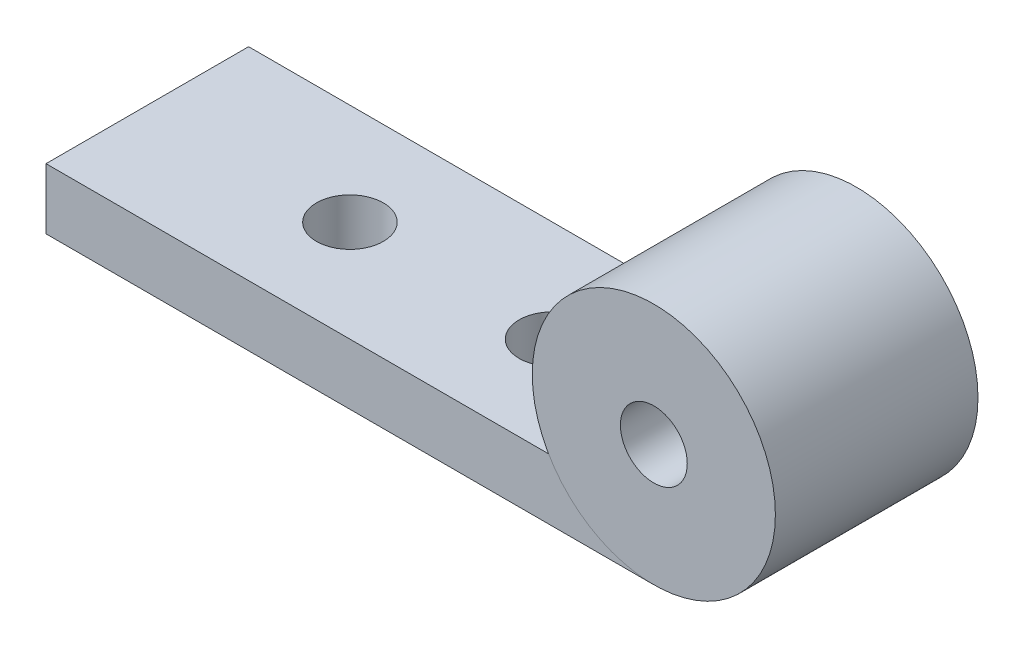
ISO-10303-21;
HEADER;
FILE_DESCRIPTION(('STEP AP214'),'2;1');
FILE_NAME('part.step','',(''),(''),'','','');
FILE_SCHEMA(('AUTOMOTIVE_DESIGN { 1 0 10303 214 1 1 1 1 }'));
ENDSEC;
DATA;
#1=APPLICATION_CONTEXT('core data for automotive mechanical design processes');
#2=APPLICATION_PROTOCOL_DEFINITION('international standard','automotive_design',2000,#1);
#3=PRODUCT_CONTEXT('',#1,'mechanical');
#4=PRODUCT('Part','Part','',(#3));
#5=PRODUCT_RELATED_PRODUCT_CATEGORY('part','',(#4));
#6=PRODUCT_DEFINITION_FORMATION('','',#4);
#7=PRODUCT_DEFINITION_CONTEXT('part definition',#1,'design');
#8=PRODUCT_DEFINITION('design','',#6,#7);
#9=PRODUCT_DEFINITION_SHAPE('','',#8);
#10=(LENGTH_UNIT() NAMED_UNIT(*) SI_UNIT(.MILLI.,.METRE.));
#11=(NAMED_UNIT(*) PLANE_ANGLE_UNIT() SI_UNIT($,.RADIAN.));
#12=(NAMED_UNIT(*) SI_UNIT($,.STERADIAN.) SOLID_ANGLE_UNIT());
#13=UNCERTAINTY_MEASURE_WITH_UNIT(LENGTH_MEASURE(1.E-05),#10,'distance_accuracy_value','');
#14=(GEOMETRIC_REPRESENTATION_CONTEXT(3) GLOBAL_UNCERTAINTY_ASSIGNED_CONTEXT((#13)) GLOBAL_UNIT_ASSIGNED_CONTEXT((#10,
#11,#12)) REPRESENTATION_CONTEXT('',''));
#15=CARTESIAN_POINT('',(0.,0.,0.));
#16=DIRECTION('',(0.,0.,1.));
#17=DIRECTION('',(1.,0.,0.));
#18=AXIS2_PLACEMENT_3D('',#15,#16,#17);
#19=CARTESIAN_POINT('',(15.,6.,-5.));
#20=DIRECTION('',(0.,0.,1.));
#21=DIRECTION('',(1.,0.,0.));
#22=AXIS2_PLACEMENT_3D('',#19,#20,#21);
#23=CYLINDRICAL_SURFACE('',#22,6.);
#24=CARTESIAN_POINT('',(15.,6.,-5.));
#25=DIRECTION('',(0.,0.,1.));
#26=DIRECTION('',(1.,0.,0.));
#27=AXIS2_PLACEMENT_3D('',#24,#25,#26);
#28=CIRCLE('',#27,6.);
#29=CARTESIAN_POINT('',(21.,6.,-5.));
#30=VERTEX_POINT('',#29);
#31=EDGE_CURVE('E11',#30,#30,#28,.T.);
#32=ORIENTED_EDGE('',*,*,#31,.T.);
#33=EDGE_LOOP('',(#32));
#34=FACE_BOUND('',#33,.T.);
#35=CARTESIAN_POINT('',(15.,6.,5.));
#36=DIRECTION('',(0.,0.,1.));
#37=DIRECTION('',(1.,0.,0.));
#38=AXIS2_PLACEMENT_3D('',#35,#36,#37);
#39=CIRCLE('',#38,6.);
#40=CARTESIAN_POINT('',(21.,6.,5.));
#41=VERTEX_POINT('',#40);
#42=EDGE_CURVE('E46',#41,#41,#39,.T.);
#43=ORIENTED_EDGE('',*,*,#42,.F.);
#44=EDGE_LOOP('',(#43));
#45=FACE_BOUND('',#44,.T.);
#46=ADVANCED_FACE('F43',(#34,#45),#23,.T.);
#47=CARTESIAN_POINT('',(15.,6.,-5.));
#48=DIRECTION('',(0.,0.,1.));
#49=DIRECTION('',(1.,0.,0.));
#50=AXIS2_PLACEMENT_3D('',#47,#48,#49);
#51=PLANE('',#50);
#52=CARTESIAN_POINT('',(15.,6.,-5.));
#53=DIRECTION('',(0.,0.,1.));
#54=DIRECTION('',(1.,0.,0.));
#55=AXIS2_PLACEMENT_3D('',#52,#53,#54);
#56=CIRCLE('',#55,1.65);
#57=CARTESIAN_POINT('',(16.65,6.,-5.));
#58=VERTEX_POINT('',#57);
#59=EDGE_CURVE('E53',#58,#58,#56,.T.);
#60=ORIENTED_EDGE('',*,*,#59,.T.);
#61=EDGE_LOOP('',(#60));
#62=FACE_BOUND('',#61,.T.);
#63=ORIENTED_EDGE('',*,*,#31,.F.);
#64=EDGE_LOOP('',(#63));
#65=FACE_BOUND('',#64,.T.);
#66=ADVANCED_FACE('F61',(#62,#65),#51,.F.);
#67=CARTESIAN_POINT('',(15.,6.,5.));
#68=DIRECTION('',(0.,0.,1.));
#69=DIRECTION('',(1.,0.,0.));
#70=AXIS2_PLACEMENT_3D('',#67,#68,#69);
#71=PLANE('',#70);
#72=CARTESIAN_POINT('',(15.,6.,5.));
#73=DIRECTION('',(0.,0.,1.));
#74=DIRECTION('',(1.,0.,0.));
#75=AXIS2_PLACEMENT_3D('',#72,#73,#74);
#76=CIRCLE('',#75,1.65);
#77=CARTESIAN_POINT('',(16.65,6.,5.));
#78=VERTEX_POINT('',#77);
#79=EDGE_CURVE('E55',#78,#78,#76,.T.);
#80=ORIENTED_EDGE('',*,*,#79,.F.);
#81=EDGE_LOOP('',(#80));
#82=FACE_BOUND('',#81,.T.);
#83=ORIENTED_EDGE('',*,*,#42,.T.);
#84=EDGE_LOOP('',(#83));
#85=FACE_BOUND('',#84,.T.);
#86=ADVANCED_FACE('F67',(#82,#85),#71,.T.);
#87=CARTESIAN_POINT('',(15.,6.,-5.));
#88=DIRECTION('',(0.,0.,1.));
#89=DIRECTION('',(1.,0.,0.));
#90=AXIS2_PLACEMENT_3D('',#87,#88,#89);
#91=CYLINDRICAL_SURFACE('',#90,1.65);
#92=ORIENTED_EDGE('',*,*,#59,.F.);
#93=EDGE_LOOP('',(#92));
#94=FACE_BOUND('',#93,.T.);
#95=ORIENTED_EDGE('',*,*,#79,.T.);
#96=EDGE_LOOP('',(#95));
#97=FACE_BOUND('',#96,.T.);
#98=ADVANCED_FACE('F64',(#94,#97),#91,.F.);
#99=CLOSED_SHELL('',(#46,#66,#86,#98));
#100=MANIFOLD_SOLID_BREP('B2',#99);
#101=CARTESIAN_POINT('',(0.,3.,0.));
#102=DIRECTION('',(0.,-1.,0.));
#103=DIRECTION('',(0.,0.,-1.));
#104=AXIS2_PLACEMENT_3D('',#101,#102,#103);
#105=PLANE('',#104);
#106=DIRECTION('',(0.,0.,-1.));
#107=VECTOR('',#106,1.);
#108=CARTESIAN_POINT('',(15.,3.,5.));
#109=LINE('',#108,#107);
#110=CARTESIAN_POINT('',(15.,3.,5.));
#111=VERTEX_POINT('',#110);
#112=CARTESIAN_POINT('',(15.,3.,-5.));
#113=VERTEX_POINT('',#112);
#114=EDGE_CURVE('E157',#111,#113,#109,.T.);
#115=ORIENTED_EDGE('',*,*,#114,.T.);
#116=DIRECTION('',(-1.,0.,0.));
#117=VECTOR('',#116,1.);
#118=CARTESIAN_POINT('',(-15.,3.,-5.));
#119=LINE('',#118,#117);
#120=CARTESIAN_POINT('',(-15.,3.,-5.));
#121=VERTEX_POINT('',#120);
#122=EDGE_CURVE('E152',#113,#121,#119,.T.);
#123=ORIENTED_EDGE('',*,*,#122,.T.);
#124=DIRECTION('',(0.,0.,1.));
#125=VECTOR('',#124,1.);
#126=CARTESIAN_POINT('',(-15.,3.,5.));
#127=LINE('',#126,#125);
#128=CARTESIAN_POINT('',(-15.,3.,5.));
#129=VERTEX_POINT('',#128);
#130=EDGE_CURVE('E155',#121,#129,#127,.T.);
#131=ORIENTED_EDGE('',*,*,#130,.T.);
#132=DIRECTION('',(1.,0.,0.));
#133=VECTOR('',#132,1.);
#134=CARTESIAN_POINT('',(-15.,3.,5.));
#135=LINE('',#134,#133);
#136=EDGE_CURVE('E122',#129,#111,#135,.T.);
#137=ORIENTED_EDGE('',*,*,#136,.T.);
#138=EDGE_LOOP('',(#115,#123,#131,#137));
#139=FACE_BOUND('',#138,.T.);
#140=CARTESIAN_POINT('',(-4.99999999999999,3.,0.));
#141=DIRECTION('',(0.,1.,0.));
#142=DIRECTION('',(0.,0.,1.));
#143=AXIS2_PLACEMENT_3D('',#140,#141,#142);
#144=CIRCLE('',#143,1.65);
#145=CARTESIAN_POINT('',(-4.99999999999999,3.,1.65));
#146=VERTEX_POINT('',#145);
#147=EDGE_CURVE('E172',#146,#146,#144,.T.);
#148=ORIENTED_EDGE('',*,*,#147,.F.);
#149=EDGE_LOOP('',(#148));
#150=FACE_BOUND('',#149,.T.);
#151=CARTESIAN_POINT('',(5.00000000000001,3.,0.));
#152=DIRECTION('',(0.,1.,0.));
#153=DIRECTION('',(0.,0.,1.));
#154=AXIS2_PLACEMENT_3D('',#151,#152,#153);
#155=CIRCLE('',#154,1.65);
#156=CARTESIAN_POINT('',(5.00000000000001,3.,1.65));
#157=VERTEX_POINT('',#156);
#158=EDGE_CURVE('E187',#157,#157,#155,.T.);
#159=ORIENTED_EDGE('',*,*,#158,.F.);
#160=EDGE_LOOP('',(#159));
#161=FACE_BOUND('',#160,.T.);
#162=ADVANCED_FACE('F105',(#139,#150,#161),#105,.F.);
#163=CARTESIAN_POINT('',(0.,0.,0.));
#164=DIRECTION('',(0.,-1.,0.));
#165=DIRECTION('',(0.,0.,-1.));
#166=AXIS2_PLACEMENT_3D('',#163,#164,#165);
#167=PLANE('',#166);
#168=CARTESIAN_POINT('',(-4.99999999999999,0.,0.));
#169=DIRECTION('',(0.,1.,0.));
#170=DIRECTION('',(0.,0.,1.));
#171=AXIS2_PLACEMENT_3D('',#168,#169,#170);
#172=CIRCLE('',#171,1.65);
#173=CARTESIAN_POINT('',(-4.99999999999999,0.,1.65));
#174=VERTEX_POINT('',#173);
#175=EDGE_CURVE('E184',#174,#174,#172,.T.);
#176=ORIENTED_EDGE('',*,*,#175,.T.);
#177=EDGE_LOOP('',(#176));
#178=FACE_BOUND('',#177,.T.);
#179=DIRECTION('',(0.,0.,-1.));
#180=VECTOR('',#179,1.);
#181=CARTESIAN_POINT('',(15.,0.,5.));
#182=LINE('',#181,#180);
#183=CARTESIAN_POINT('',(15.,0.,5.));
#184=VERTEX_POINT('',#183);
#185=CARTESIAN_POINT('',(15.,0.,-5.));
#186=VERTEX_POINT('',#185);
#187=EDGE_CURVE('E169',#184,#186,#182,.T.);
#188=ORIENTED_EDGE('',*,*,#187,.F.);
#189=DIRECTION('',(1.,0.,0.));
#190=VECTOR('',#189,1.);
#191=CARTESIAN_POINT('',(-15.,0.,5.));
#192=LINE('',#191,#190);
#193=CARTESIAN_POINT('',(-15.,0.,5.));
#194=VERTEX_POINT('',#193);
#195=EDGE_CURVE('E145',#194,#184,#192,.T.);
#196=ORIENTED_EDGE('',*,*,#195,.F.);
#197=DIRECTION('',(0.,0.,1.));
#198=VECTOR('',#197,1.);
#199=CARTESIAN_POINT('',(-15.,0.,5.));
#200=LINE('',#199,#198);
#201=CARTESIAN_POINT('',(-15.,0.,-5.));
#202=VERTEX_POINT('',#201);
#203=EDGE_CURVE('E139',#202,#194,#200,.T.);
#204=ORIENTED_EDGE('',*,*,#203,.F.);
#205=DIRECTION('',(-1.,0.,0.));
#206=VECTOR('',#205,1.);
#207=CARTESIAN_POINT('',(-15.,0.,-5.));
#208=LINE('',#207,#206);
#209=EDGE_CURVE('E161',#186,#202,#208,.T.);
#210=ORIENTED_EDGE('',*,*,#209,.F.);
#211=EDGE_LOOP('',(#188,#196,#204,#210));
#212=FACE_BOUND('',#211,.T.);
#213=CARTESIAN_POINT('',(5.00000000000001,0.,0.));
#214=DIRECTION('',(0.,1.,0.));
#215=DIRECTION('',(0.,0.,1.));
#216=AXIS2_PLACEMENT_3D('',#213,#214,#215);
#217=CIRCLE('',#216,1.65);
#218=CARTESIAN_POINT('',(5.00000000000001,0.,1.65));
#219=VERTEX_POINT('',#218);
#220=EDGE_CURVE('E190',#219,#219,#217,.T.);
#221=ORIENTED_EDGE('',*,*,#220,.T.);
#222=EDGE_LOOP('',(#221));
#223=FACE_BOUND('',#222,.T.);
#224=ADVANCED_FACE('F180',(#178,#212,#223),#167,.T.);
#225=CARTESIAN_POINT('',(15.,3.,5.));
#226=DIRECTION('',(-1.,0.,0.));
#227=DIRECTION('',(0.,0.,1.));
#228=AXIS2_PLACEMENT_3D('',#225,#226,#227);
#229=PLANE('',#228);
#230=ORIENTED_EDGE('',*,*,#187,.T.);
#231=DIRECTION('',(0.,-1.,0.));
#232=VECTOR('',#231,1.);
#233=CARTESIAN_POINT('',(15.,3.,-5.));
#234=LINE('',#233,#232);
#235=EDGE_CURVE('E41',#113,#186,#234,.T.);
#236=ORIENTED_EDGE('',*,*,#235,.F.);
#237=ORIENTED_EDGE('',*,*,#114,.F.);
#238=DIRECTION('',(0.,-1.,0.));
#239=VECTOR('',#238,1.);
#240=CARTESIAN_POINT('',(15.,3.,5.));
#241=LINE('',#240,#239);
#242=EDGE_CURVE('E165',#111,#184,#241,.T.);
#243=ORIENTED_EDGE('',*,*,#242,.T.);
#244=EDGE_LOOP('',(#230,#236,#237,#243));
#245=FACE_BOUND('',#244,.T.);
#246=ADVANCED_FACE('F107',(#245),#229,.F.);
#247=CARTESIAN_POINT('',(-15.,3.,-5.));
#248=DIRECTION('',(0.,0.,1.));
#249=DIRECTION('',(1.,0.,0.));
#250=AXIS2_PLACEMENT_3D('',#247,#248,#249);
#251=PLANE('',#250);
#252=ORIENTED_EDGE('',*,*,#209,.T.);
#253=DIRECTION('',(0.,-1.,0.));
#254=VECTOR('',#253,1.);
#255=CARTESIAN_POINT('',(-15.,3.,-5.));
#256=LINE('',#255,#254);
#257=EDGE_CURVE('E114',#121,#202,#256,.T.);
#258=ORIENTED_EDGE('',*,*,#257,.F.);
#259=ORIENTED_EDGE('',*,*,#122,.F.);
#260=ORIENTED_EDGE('',*,*,#235,.T.);
#261=EDGE_LOOP('',(#252,#258,#259,#260));
#262=FACE_BOUND('',#261,.T.);
#263=ADVANCED_FACE('F160',(#262),#251,.F.);
#264=CARTESIAN_POINT('',(-15.,3.,5.));
#265=DIRECTION('',(1.,0.,0.));
#266=DIRECTION('',(0.,0.,-1.));
#267=AXIS2_PLACEMENT_3D('',#264,#265,#266);
#268=PLANE('',#267);
#269=ORIENTED_EDGE('',*,*,#203,.T.);
#270=DIRECTION('',(0.,-1.,0.));
#271=VECTOR('',#270,1.);
#272=CARTESIAN_POINT('',(-15.,3.,5.));
#273=LINE('',#272,#271);
#274=EDGE_CURVE('E162',#129,#194,#273,.T.);
#275=ORIENTED_EDGE('',*,*,#274,.F.);
#276=ORIENTED_EDGE('',*,*,#130,.F.);
#277=ORIENTED_EDGE('',*,*,#257,.T.);
#278=EDGE_LOOP('',(#269,#275,#276,#277));
#279=FACE_BOUND('',#278,.T.);
#280=ADVANCED_FACE('F163',(#279),#268,.F.);
#281=CARTESIAN_POINT('',(-15.,3.,5.));
#282=DIRECTION('',(0.,0.,-1.));
#283=DIRECTION('',(-1.,0.,0.));
#284=AXIS2_PLACEMENT_3D('',#281,#282,#283);
#285=PLANE('',#284);
#286=ORIENTED_EDGE('',*,*,#195,.T.);
#287=ORIENTED_EDGE('',*,*,#242,.F.);
#288=ORIENTED_EDGE('',*,*,#136,.F.);
#289=ORIENTED_EDGE('',*,*,#274,.T.);
#290=EDGE_LOOP('',(#286,#287,#288,#289));
#291=FACE_BOUND('',#290,.T.);
#292=ADVANCED_FACE('F177',(#291),#285,.F.);
#293=CARTESIAN_POINT('',(-4.99999999999999,3.,0.));
#294=DIRECTION('',(0.,-1.,0.));
#295=DIRECTION('',(0.,0.,-1.));
#296=AXIS2_PLACEMENT_3D('',#293,#294,#295);
#297=CYLINDRICAL_SURFACE('',#296,1.65);
#298=ORIENTED_EDGE('',*,*,#147,.T.);
#299=EDGE_LOOP('',(#298));
#300=FACE_BOUND('',#299,.T.);
#301=ORIENTED_EDGE('',*,*,#175,.F.);
#302=EDGE_LOOP('',(#301));
#303=FACE_BOUND('',#302,.T.);
#304=ADVANCED_FACE('F207',(#300,#303),#297,.F.);
#305=CARTESIAN_POINT('',(5.00000000000001,3.,0.));
#306=DIRECTION('',(0.,-1.,0.));
#307=DIRECTION('',(0.,0.,-1.));
#308=AXIS2_PLACEMENT_3D('',#305,#306,#307);
#309=CYLINDRICAL_SURFACE('',#308,1.65);
#310=ORIENTED_EDGE('',*,*,#158,.T.);
#311=EDGE_LOOP('',(#310));
#312=FACE_BOUND('',#311,.T.);
#313=ORIENTED_EDGE('',*,*,#220,.F.);
#314=EDGE_LOOP('',(#313));
#315=FACE_BOUND('',#314,.T.);
#316=ADVANCED_FACE('F196',(#312,#315),#309,.F.);
#317=CLOSED_SHELL('',(#162,#224,#246,#263,#280,#292,#304,#316));
#318=MANIFOLD_SOLID_BREP('B6',#317);
#319=ADVANCED_BREP_SHAPE_REPRESENTATION('',(#18,#100,#318),#14);
#320=SHAPE_DEFINITION_REPRESENTATION(#9,#319);
ENDSEC;
END-ISO-10303-21;
